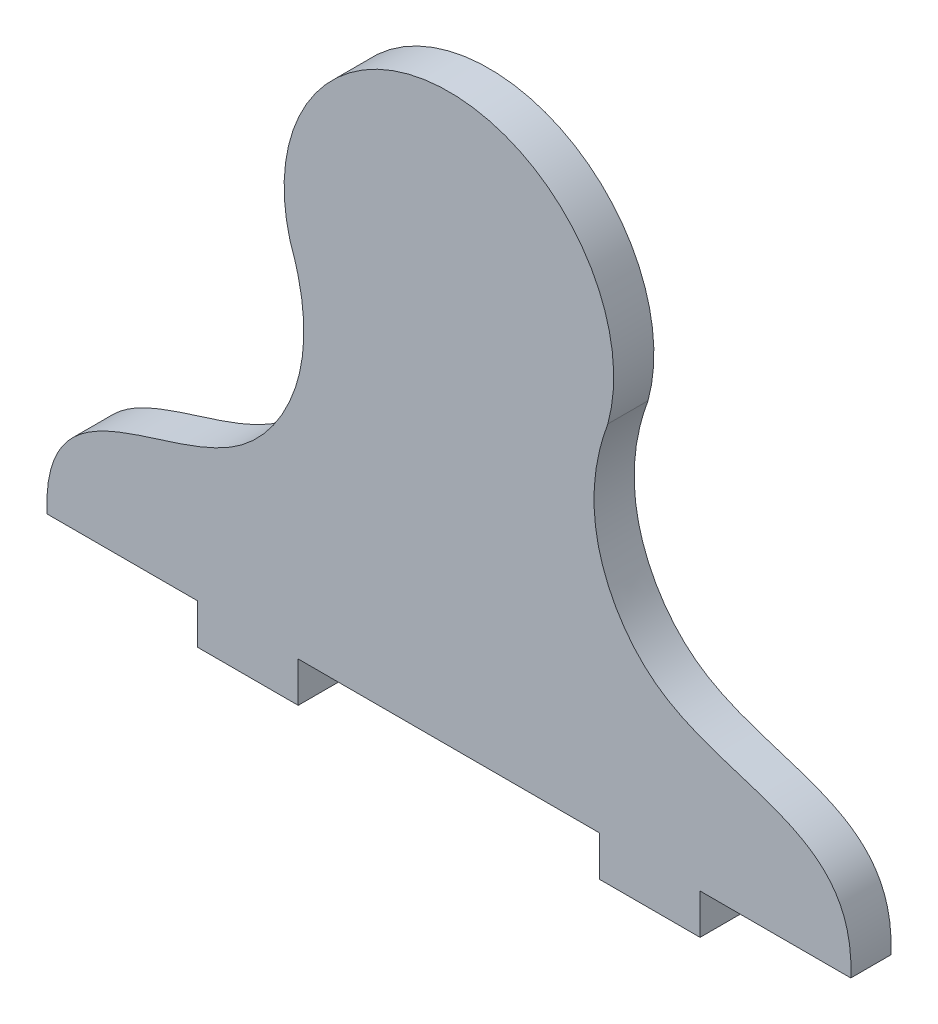
ISO-10303-21;
HEADER;
FILE_DESCRIPTION(('STEP AP214'),'2;1');
FILE_NAME('part.step','',(''),(''),'','','');
FILE_SCHEMA(('AUTOMOTIVE_DESIGN { 1 0 10303 214 1 1 1 1 }'));
ENDSEC;
DATA;
#1=APPLICATION_CONTEXT('core data for automotive mechanical design processes');
#2=APPLICATION_PROTOCOL_DEFINITION('international standard','automotive_design',2000,#1);
#3=PRODUCT_CONTEXT('',#1,'mechanical');
#4=PRODUCT('Part','Part','',(#3));
#5=PRODUCT_RELATED_PRODUCT_CATEGORY('part','',(#4));
#6=PRODUCT_DEFINITION_FORMATION('','',#4);
#7=PRODUCT_DEFINITION_CONTEXT('part definition',#1,'design');
#8=PRODUCT_DEFINITION('design','',#6,#7);
#9=PRODUCT_DEFINITION_SHAPE('','',#8);
#10=(LENGTH_UNIT() NAMED_UNIT(*) SI_UNIT(.MILLI.,.METRE.));
#11=(NAMED_UNIT(*) PLANE_ANGLE_UNIT() SI_UNIT($,.RADIAN.));
#12=(NAMED_UNIT(*) SI_UNIT($,.STERADIAN.) SOLID_ANGLE_UNIT());
#13=UNCERTAINTY_MEASURE_WITH_UNIT(LENGTH_MEASURE(1.E-05),#10,'distance_accuracy_value','');
#14=(GEOMETRIC_REPRESENTATION_CONTEXT(3) GLOBAL_UNCERTAINTY_ASSIGNED_CONTEXT((#13)) GLOBAL_UNIT_ASSIGNED_CONTEXT((#10,
#11,#12)) REPRESENTATION_CONTEXT('',''));
#15=CARTESIAN_POINT('',(0.,0.,0.));
#16=DIRECTION('',(0.,0.,1.));
#17=DIRECTION('',(1.,0.,0.));
#18=AXIS2_PLACEMENT_3D('',#15,#16,#17);
#19=CARTESIAN_POINT('',(40.,40.,4.));
#20=DIRECTION('',(0.,0.,-1.));
#21=DIRECTION('',(-1.,0.,0.));
#22=AXIS2_PLACEMENT_3D('',#19,#20,#21);
#23=CYLINDRICAL_SURFACE('',#22,16.4013850359515);
#24=CARTESIAN_POINT('',(40.,40.,0.));
#25=DIRECTION('',(0.,0.,1.));
#26=DIRECTION('',(1.,0.,0.));
#27=AXIS2_PLACEMENT_3D('',#24,#25,#26);
#28=CIRCLE('',#27,16.4013850359515);
#29=CARTESIAN_POINT('',(55.819281992137,35.6692092695694,0.));
#30=VERTEX_POINT('',#29);
#31=CARTESIAN_POINT('',(24.180718007863,35.6692092695694,0.));
#32=VERTEX_POINT('',#31);
#33=EDGE_CURVE('E151',#30,#32,#28,.T.);
#34=ORIENTED_EDGE('',*,*,#33,.T.);
#35=DIRECTION('',(0.,0.,-1.));
#36=VECTOR('',#35,1.);
#37=CARTESIAN_POINT('',(24.180718007863,35.6692092695694,4.));
#38=LINE('',#37,#36);
#39=CARTESIAN_POINT('',(24.180718007863,35.6692092695694,4.));
#40=VERTEX_POINT('',#39);
#41=EDGE_CURVE('E11',#40,#32,#38,.T.);
#42=ORIENTED_EDGE('',*,*,#41,.F.);
#43=CARTESIAN_POINT('',(40.,40.,4.));
#44=DIRECTION('',(0.,0.,1.));
#45=DIRECTION('',(1.,0.,0.));
#46=AXIS2_PLACEMENT_3D('',#43,#44,#45);
#47=CIRCLE('',#46,16.4013850359515);
#48=CARTESIAN_POINT('',(55.819281992137,35.6692092695694,4.));
#49=VERTEX_POINT('',#48);
#50=EDGE_CURVE('E95',#49,#40,#47,.T.);
#51=ORIENTED_EDGE('',*,*,#50,.F.);
#52=DIRECTION('',(0.,0.,-1.));
#53=VECTOR('',#52,1.);
#54=CARTESIAN_POINT('',(55.819281992137,35.6692092695694,4.));
#55=LINE('',#54,#53);
#56=EDGE_CURVE('E144',#49,#30,#55,.T.);
#57=ORIENTED_EDGE('',*,*,#56,.T.);
#58=EDGE_LOOP('',(#34,#42,#51,#57));
#59=FACE_BOUND('',#58,.T.);
#60=ADVANCED_FACE('F31',(#59),#23,.T.);
#61=CARTESIAN_POINT('',(0.,0.,4.));
#62=CARTESIAN_POINT('',(-0.558151578686706,12.4298564359086,4.));
#63=CARTESIAN_POINT('',(16.9175016425389,9.40079553194487,4.));
#64=CARTESIAN_POINT('',(26.3378265297337,24.3930560454273,4.));
#65=CARTESIAN_POINT('',(25.6267499995978,31.8044696165519,4.));
#66=CARTESIAN_POINT('',(24.180718007863,35.6692092695694,4.));
#67=B_SPLINE_CURVE_WITH_KNOTS('',3,(#61,#62,#63,#64,#65,#66),.UNSPECIFIED.,.F.,.F.,(4,1,1,4),
(0.,0.19768833588022,0.274980814333249,0.360749457079554),.UNSPECIFIED.);
#68=DIRECTION('',(0.,0.,-1.));
#69=VECTOR('',#68,1.);
#70=SURFACE_OF_LINEAR_EXTRUSION('',#67,#69);
#71=CARTESIAN_POINT('',(0.,0.,0.));
#72=CARTESIAN_POINT('',(-0.558151578686706,12.4298564359086,0.));
#73=CARTESIAN_POINT('',(16.9175016425389,9.40079553194487,0.));
#74=CARTESIAN_POINT('',(26.3378265297337,24.3930560454273,0.));
#75=CARTESIAN_POINT('',(25.6267499995978,31.8044696165519,0.));
#76=CARTESIAN_POINT('',(24.180718007863,35.6692092695694,0.));
#77=B_SPLINE_CURVE_WITH_KNOTS('',3,(#71,#72,#73,#74,#75,#76),.UNSPECIFIED.,.F.,.F.,(4,1,1,4),
(0.,0.19768833588022,0.274980814333249,0.360749457079554),.UNSPECIFIED.);
#78=CARTESIAN_POINT('',(0.,0.,0.));
#79=VERTEX_POINT('',#78);
#80=EDGE_CURVE('E257',#79,#32,#77,.T.);
#81=ORIENTED_EDGE('',*,*,#80,.F.);
#82=DIRECTION('',(0.,0.,-1.));
#83=VECTOR('',#82,1.);
#84=CARTESIAN_POINT('',(0.,0.,4.));
#85=LINE('',#84,#83);
#86=CARTESIAN_POINT('',(0.,0.,4.));
#87=VERTEX_POINT('',#86);
#88=EDGE_CURVE('E39',#87,#79,#85,.T.);
#89=ORIENTED_EDGE('',*,*,#88,.F.);
#90=EDGE_CURVE('E198',#87,#40,#67,.T.);
#91=ORIENTED_EDGE('',*,*,#90,.T.);
#92=ORIENTED_EDGE('',*,*,#41,.T.);
#93=EDGE_LOOP('',(#81,#89,#91,#92));
#94=FACE_BOUND('',#93,.T.);
#95=ADVANCED_FACE('F193',(#94),#70,.T.);
#96=CARTESIAN_POINT('',(39.9972327386168,0.,4.));
#97=DIRECTION('',(0.,1.,0.));
#98=DIRECTION('',(-1.,0.,0.));
#99=AXIS2_PLACEMENT_3D('',#96,#97,#98);
#100=PLANE('',#99);
#101=DIRECTION('',(1.,0.,0.));
#102=VECTOR('',#101,1.);
#103=CARTESIAN_POINT('',(39.9972327386168,0.,0.));
#104=LINE('',#103,#102);
#105=CARTESIAN_POINT('',(15.,0.,0.));
#106=VERTEX_POINT('',#105);
#107=EDGE_CURVE('E251',#79,#106,#104,.T.);
#108=ORIENTED_EDGE('',*,*,#107,.T.);
#109=DIRECTION('',(0.,0.,-1.));
#110=VECTOR('',#109,1.);
#111=CARTESIAN_POINT('',(15.,0.,4.));
#112=LINE('',#111,#110);
#113=CARTESIAN_POINT('',(15.,0.,4.));
#114=VERTEX_POINT('',#113);
#115=EDGE_CURVE('E246',#114,#106,#112,.T.);
#116=ORIENTED_EDGE('',*,*,#115,.F.);
#117=DIRECTION('',(1.,0.,0.));
#118=VECTOR('',#117,1.);
#119=CARTESIAN_POINT('',(39.9972327386168,0.,4.));
#120=LINE('',#119,#118);
#121=EDGE_CURVE('E205',#87,#114,#120,.T.);
#122=ORIENTED_EDGE('',*,*,#121,.F.);
#123=ORIENTED_EDGE('',*,*,#88,.T.);
#124=EDGE_LOOP('',(#108,#116,#122,#123));
#125=FACE_BOUND('',#124,.T.);
#126=ADVANCED_FACE('F190',(#125),#100,.F.);
#127=CARTESIAN_POINT('',(15.,-69.6766250954229,4.));
#128=DIRECTION('',(1.,0.,0.));
#129=DIRECTION('',(0.,1.,0.));
#130=AXIS2_PLACEMENT_3D('',#127,#128,#129);
#131=PLANE('',#130);
#132=DIRECTION('',(0.,-1.,0.));
#133=VECTOR('',#132,1.);
#134=CARTESIAN_POINT('',(15.,-69.6766250954229,0.));
#135=LINE('',#134,#133);
#136=CARTESIAN_POINT('',(15.,-4.,0.));
#137=VERTEX_POINT('',#136);
#138=EDGE_CURVE('E260',#106,#137,#135,.T.);
#139=ORIENTED_EDGE('',*,*,#138,.T.);
#140=DIRECTION('',(0.,0.,-1.));
#141=VECTOR('',#140,1.);
#142=CARTESIAN_POINT('',(15.,-4.,4.));
#143=LINE('',#142,#141);
#144=CARTESIAN_POINT('',(15.,-4.,4.));
#145=VERTEX_POINT('',#144);
#146=EDGE_CURVE('E244',#145,#137,#143,.T.);
#147=ORIENTED_EDGE('',*,*,#146,.F.);
#148=DIRECTION('',(0.,-1.,0.));
#149=VECTOR('',#148,1.);
#150=CARTESIAN_POINT('',(15.,-69.6766250954229,4.));
#151=LINE('',#150,#149);
#152=EDGE_CURVE('E210',#114,#145,#151,.T.);
#153=ORIENTED_EDGE('',*,*,#152,.F.);
#154=ORIENTED_EDGE('',*,*,#115,.T.);
#155=EDGE_LOOP('',(#139,#147,#153,#154));
#156=FACE_BOUND('',#155,.T.);
#157=ADVANCED_FACE('F186',(#156),#131,.F.);
#158=CARTESIAN_POINT('',(39.9972327386168,-4.,4.));
#159=DIRECTION('',(0.,-1.,0.));
#160=DIRECTION('',(0.,0.,-1.));
#161=AXIS2_PLACEMENT_3D('',#158,#159,#160);
#162=PLANE('',#161);
#163=DIRECTION('',(-1.,0.,0.));
#164=VECTOR('',#163,1.);
#165=CARTESIAN_POINT('',(39.9972327386168,-4.,0.));
#166=LINE('',#165,#164);
#167=CARTESIAN_POINT('',(25.,-4.,0.));
#168=VERTEX_POINT('',#167);
#169=EDGE_CURVE('E270',#168,#137,#166,.T.);
#170=ORIENTED_EDGE('',*,*,#169,.F.);
#171=DIRECTION('',(0.,0.,-1.));
#172=VECTOR('',#171,1.);
#173=CARTESIAN_POINT('',(25.,-4.,4.));
#174=LINE('',#173,#172);
#175=CARTESIAN_POINT('',(25.,-4.,4.));
#176=VERTEX_POINT('',#175);
#177=EDGE_CURVE('E242',#176,#168,#174,.T.);
#178=ORIENTED_EDGE('',*,*,#177,.F.);
#179=DIRECTION('',(-1.,0.,0.));
#180=VECTOR('',#179,1.);
#181=CARTESIAN_POINT('',(39.9972327386168,-4.,4.));
#182=LINE('',#181,#180);
#183=EDGE_CURVE('E212',#176,#145,#182,.T.);
#184=ORIENTED_EDGE('',*,*,#183,.T.);
#185=ORIENTED_EDGE('',*,*,#146,.T.);
#186=EDGE_LOOP('',(#170,#178,#184,#185));
#187=FACE_BOUND('',#186,.T.);
#188=ADVANCED_FACE('F182',(#187),#162,.T.);
#189=CARTESIAN_POINT('',(25.,-69.6766250954229,4.));
#190=DIRECTION('',(1.,0.,0.));
#191=DIRECTION('',(0.,0.,-1.));
#192=AXIS2_PLACEMENT_3D('',#189,#190,#191);
#193=PLANE('',#192);
#194=DIRECTION('',(0.,-1.,0.));
#195=VECTOR('',#194,1.);
#196=CARTESIAN_POINT('',(25.,-69.6766250954229,0.));
#197=LINE('',#196,#195);
#198=CARTESIAN_POINT('',(25.,0.,0.));
#199=VERTEX_POINT('',#198);
#200=EDGE_CURVE('E272',#199,#168,#197,.T.);
#201=ORIENTED_EDGE('',*,*,#200,.F.);
#202=DIRECTION('',(0.,0.,-1.));
#203=VECTOR('',#202,1.);
#204=CARTESIAN_POINT('',(25.,0.,4.));
#205=LINE('',#204,#203);
#206=CARTESIAN_POINT('',(25.,0.,4.));
#207=VERTEX_POINT('',#206);
#208=EDGE_CURVE('E240',#207,#199,#205,.T.);
#209=ORIENTED_EDGE('',*,*,#208,.F.);
#210=DIRECTION('',(0.,-1.,0.));
#211=VECTOR('',#210,1.);
#212=CARTESIAN_POINT('',(25.,-69.6766250954229,4.));
#213=LINE('',#212,#211);
#214=EDGE_CURVE('E215',#207,#176,#213,.T.);
#215=ORIENTED_EDGE('',*,*,#214,.T.);
#216=ORIENTED_EDGE('',*,*,#177,.T.);
#217=EDGE_LOOP('',(#201,#209,#215,#216));
#218=FACE_BOUND('',#217,.T.);
#219=ADVANCED_FACE('F178',(#218),#193,.T.);
#220=CARTESIAN_POINT('',(39.9972327386168,0.,4.));
#221=DIRECTION('',(0.,1.,0.));
#222=DIRECTION('',(0.,0.,1.));
#223=AXIS2_PLACEMENT_3D('',#220,#221,#222);
#224=PLANE('',#223);
#225=DIRECTION('',(1.,0.,0.));
#226=VECTOR('',#225,1.);
#227=CARTESIAN_POINT('',(39.9972327386168,0.,0.));
#228=LINE('',#227,#226);
#229=CARTESIAN_POINT('',(55.,0.,0.));
#230=VERTEX_POINT('',#229);
#231=EDGE_CURVE('E275',#199,#230,#228,.T.);
#232=ORIENTED_EDGE('',*,*,#231,.T.);
#233=DIRECTION('',(0.,0.,-1.));
#234=VECTOR('',#233,1.);
#235=CARTESIAN_POINT('',(55.,0.,4.));
#236=LINE('',#235,#234);
#237=CARTESIAN_POINT('',(55.,0.,4.));
#238=VERTEX_POINT('',#237);
#239=EDGE_CURVE('E233',#238,#230,#236,.T.);
#240=ORIENTED_EDGE('',*,*,#239,.F.);
#241=DIRECTION('',(1.,0.,0.));
#242=VECTOR('',#241,1.);
#243=CARTESIAN_POINT('',(39.9972327386168,0.,4.));
#244=LINE('',#243,#242);
#245=EDGE_CURVE('E218',#207,#238,#244,.T.);
#246=ORIENTED_EDGE('',*,*,#245,.F.);
#247=ORIENTED_EDGE('',*,*,#208,.T.);
#248=EDGE_LOOP('',(#232,#240,#246,#247));
#249=FACE_BOUND('',#248,.T.);
#250=ADVANCED_FACE('F174',(#249),#224,.F.);
#251=CARTESIAN_POINT('',(55.,-69.6766250954229,4.));
#252=DIRECTION('',(1.,0.,0.));
#253=DIRECTION('',(0.,0.,-1.));
#254=AXIS2_PLACEMENT_3D('',#251,#252,#253);
#255=PLANE('',#254);
#256=DIRECTION('',(0.,-1.,0.));
#257=VECTOR('',#256,1.);
#258=CARTESIAN_POINT('',(55.,-69.6766250954229,0.));
#259=LINE('',#258,#257);
#260=CARTESIAN_POINT('',(55.,-4.,0.));
#261=VERTEX_POINT('',#260);
#262=EDGE_CURVE('E230',#230,#261,#259,.T.);
#263=ORIENTED_EDGE('',*,*,#262,.T.);
#264=DIRECTION('',(0.,0.,-1.));
#265=VECTOR('',#264,1.);
#266=CARTESIAN_POINT('',(55.,-4.,4.));
#267=LINE('',#266,#265);
#268=CARTESIAN_POINT('',(55.,-4.,4.));
#269=VERTEX_POINT('',#268);
#270=EDGE_CURVE('E228',#269,#261,#267,.T.);
#271=ORIENTED_EDGE('',*,*,#270,.F.);
#272=DIRECTION('',(0.,-1.,0.));
#273=VECTOR('',#272,1.);
#274=CARTESIAN_POINT('',(55.,-69.6766250954229,4.));
#275=LINE('',#274,#273);
#276=EDGE_CURVE('E220',#238,#269,#275,.T.);
#277=ORIENTED_EDGE('',*,*,#276,.F.);
#278=ORIENTED_EDGE('',*,*,#239,.T.);
#279=EDGE_LOOP('',(#263,#271,#277,#278));
#280=FACE_BOUND('',#279,.T.);
#281=ADVANCED_FACE('F170',(#280),#255,.F.);
#282=CARTESIAN_POINT('',(39.9972327386168,-4.,4.));
#283=DIRECTION('',(0.,1.,0.));
#284=DIRECTION('',(0.,0.,1.));
#285=AXIS2_PLACEMENT_3D('',#282,#283,#284);
#286=PLANE('',#285);
#287=DIRECTION('',(1.,0.,0.));
#288=VECTOR('',#287,1.);
#289=CARTESIAN_POINT('',(39.9972327386168,-4.,0.));
#290=LINE('',#289,#288);
#291=CARTESIAN_POINT('',(65.,-4.,0.));
#292=VERTEX_POINT('',#291);
#293=EDGE_CURVE('E235',#261,#292,#290,.T.);
#294=ORIENTED_EDGE('',*,*,#293,.T.);
#295=DIRECTION('',(0.,0.,-1.));
#296=VECTOR('',#295,1.);
#297=CARTESIAN_POINT('',(65.,-4.,4.));
#298=LINE('',#297,#296);
#299=CARTESIAN_POINT('',(65.,-4.,4.));
#300=VERTEX_POINT('',#299);
#301=EDGE_CURVE('E134',#300,#292,#298,.T.);
#302=ORIENTED_EDGE('',*,*,#301,.F.);
#303=DIRECTION('',(1.,0.,0.));
#304=VECTOR('',#303,1.);
#305=CARTESIAN_POINT('',(39.9972327386168,-4.,4.));
#306=LINE('',#305,#304);
#307=EDGE_CURVE('E139',#269,#300,#306,.T.);
#308=ORIENTED_EDGE('',*,*,#307,.F.);
#309=ORIENTED_EDGE('',*,*,#270,.T.);
#310=EDGE_LOOP('',(#294,#302,#308,#309));
#311=FACE_BOUND('',#310,.T.);
#312=ADVANCED_FACE('F167',(#311),#286,.F.);
#313=CARTESIAN_POINT('',(65.,-69.6766250954229,4.));
#314=DIRECTION('',(1.,0.,0.));
#315=DIRECTION('',(0.,0.,-1.));
#316=AXIS2_PLACEMENT_3D('',#313,#314,#315);
#317=PLANE('',#316);
#318=DIRECTION('',(0.,-1.,0.));
#319=VECTOR('',#318,1.);
#320=CARTESIAN_POINT('',(65.,-69.6766250954229,0.));
#321=LINE('',#320,#319);
#322=CARTESIAN_POINT('',(65.,0.,0.));
#323=VERTEX_POINT('',#322);
#324=EDGE_CURVE('E129',#323,#292,#321,.T.);
#325=ORIENTED_EDGE('',*,*,#324,.F.);
#326=DIRECTION('',(0.,0.,-1.));
#327=VECTOR('',#326,1.);
#328=CARTESIAN_POINT('',(65.,0.,4.));
#329=LINE('',#328,#327);
#330=CARTESIAN_POINT('',(65.,0.,4.));
#331=VERTEX_POINT('',#330);
#332=EDGE_CURVE('E124',#331,#323,#329,.T.);
#333=ORIENTED_EDGE('',*,*,#332,.F.);
#334=DIRECTION('',(0.,-1.,0.));
#335=VECTOR('',#334,1.);
#336=CARTESIAN_POINT('',(65.,-69.6766250954229,4.));
#337=LINE('',#336,#335);
#338=EDGE_CURVE('E127',#331,#300,#337,.T.);
#339=ORIENTED_EDGE('',*,*,#338,.T.);
#340=ORIENTED_EDGE('',*,*,#301,.T.);
#341=EDGE_LOOP('',(#325,#333,#339,#340));
#342=FACE_BOUND('',#341,.T.);
#343=ADVANCED_FACE('F126',(#342),#317,.T.);
#344=CARTESIAN_POINT('',(39.9972327386168,0.,4.));
#345=DIRECTION('',(0.,-1.,0.));
#346=DIRECTION('',(1.,0.,0.));
#347=AXIS2_PLACEMENT_3D('',#344,#345,#346);
#348=PLANE('',#347);
#349=DIRECTION('',(-1.,0.,0.));
#350=VECTOR('',#349,1.);
#351=CARTESIAN_POINT('',(39.9972327386168,0.,0.));
#352=LINE('',#351,#350);
#353=CARTESIAN_POINT('',(80.,0.,0.));
#354=VERTEX_POINT('',#353);
#355=EDGE_CURVE('E280',#354,#323,#352,.T.);
#356=ORIENTED_EDGE('',*,*,#355,.F.);
#357=DIRECTION('',(0.,0.,-1.));
#358=VECTOR('',#357,1.);
#359=CARTESIAN_POINT('',(80.,0.,4.));
#360=LINE('',#359,#358);
#361=CARTESIAN_POINT('',(80.,0.,4.));
#362=VERTEX_POINT('',#361);
#363=EDGE_CURVE('E86',#362,#354,#360,.T.);
#364=ORIENTED_EDGE('',*,*,#363,.F.);
#365=DIRECTION('',(-1.,0.,0.));
#366=VECTOR('',#365,1.);
#367=CARTESIAN_POINT('',(39.9972327386168,0.,4.));
#368=LINE('',#367,#366);
#369=EDGE_CURVE('E137',#362,#331,#368,.T.);
#370=ORIENTED_EDGE('',*,*,#369,.T.);
#371=ORIENTED_EDGE('',*,*,#332,.T.);
#372=EDGE_LOOP('',(#356,#364,#370,#371));
#373=FACE_BOUND('',#372,.T.);
#374=ADVANCED_FACE('F142',(#373),#348,.T.);
#375=CARTESIAN_POINT('',(80.,0.,4.));
#376=CARTESIAN_POINT('',(80.5581515786867,12.4298564359086,4.));
#377=CARTESIAN_POINT('',(63.0824983574611,9.40079553194487,4.));
#378=CARTESIAN_POINT('',(53.6621734702663,24.3930560454273,4.));
#379=CARTESIAN_POINT('',(54.3732500004022,31.8044696165519,4.));
#380=CARTESIAN_POINT('',(55.819281992137,35.6692092695694,4.));
#381=B_SPLINE_CURVE_WITH_KNOTS('',3,(#375,#376,#377,#378,#379,#380),.UNSPECIFIED.,.F.,.F.,(4,1,
1,4),(0.,0.19768833588022,0.274980814333249,0.360749457079554),.UNSPECIFIED.);
#382=DIRECTION('',(0.,0.,-1.));
#383=VECTOR('',#382,1.);
#384=SURFACE_OF_LINEAR_EXTRUSION('',#381,#383);
#385=CARTESIAN_POINT('',(80.,0.,0.));
#386=CARTESIAN_POINT('',(80.5581515786867,12.4298564359086,0.));
#387=CARTESIAN_POINT('',(63.0824983574611,9.40079553194487,0.));
#388=CARTESIAN_POINT('',(53.6621734702663,24.3930560454273,0.));
#389=CARTESIAN_POINT('',(54.3732500004022,31.8044696165519,0.));
#390=CARTESIAN_POINT('',(55.819281992137,35.6692092695694,0.));
#391=B_SPLINE_CURVE_WITH_KNOTS('',3,(#385,#386,#387,#388,#389,#390),.UNSPECIFIED.,.F.,.F.,(4,1,
1,4),(0.,0.19768833588022,0.274980814333249,0.360749457079554),.UNSPECIFIED.);
#392=EDGE_CURVE('E89',#354,#30,#391,.T.);
#393=ORIENTED_EDGE('',*,*,#392,.T.);
#394=ORIENTED_EDGE('',*,*,#56,.F.);
#395=EDGE_CURVE('E47',#362,#49,#381,.T.);
#396=ORIENTED_EDGE('',*,*,#395,.F.);
#397=ORIENTED_EDGE('',*,*,#363,.T.);
#398=EDGE_LOOP('',(#393,#394,#396,#397));
#399=FACE_BOUND('',#398,.T.);
#400=ADVANCED_FACE('F157',(#399),#384,.F.);
#401=CARTESIAN_POINT('',(39.9972327386168,-69.6766250954229,4.));
#402=DIRECTION('',(0.,0.,1.));
#403=DIRECTION('',(1.,0.,0.));
#404=AXIS2_PLACEMENT_3D('',#401,#402,#403);
#405=PLANE('',#404);
#406=ORIENTED_EDGE('',*,*,#50,.T.);
#407=ORIENTED_EDGE('',*,*,#90,.F.);
#408=ORIENTED_EDGE('',*,*,#121,.T.);
#409=ORIENTED_EDGE('',*,*,#152,.T.);
#410=ORIENTED_EDGE('',*,*,#183,.F.);
#411=ORIENTED_EDGE('',*,*,#214,.F.);
#412=ORIENTED_EDGE('',*,*,#245,.T.);
#413=ORIENTED_EDGE('',*,*,#276,.T.);
#414=ORIENTED_EDGE('',*,*,#307,.T.);
#415=ORIENTED_EDGE('',*,*,#338,.F.);
#416=ORIENTED_EDGE('',*,*,#369,.F.);
#417=ORIENTED_EDGE('',*,*,#395,.T.);
#418=EDGE_LOOP('',(#406,#407,#408,#409,#410,#411,#412,#413,#414,#415,#416,#417));
#419=FACE_BOUND('',#418,.T.);
#420=ADVANCED_FACE('F136',(#419),#405,.T.);
#421=CARTESIAN_POINT('',(39.9972327386168,-69.6766250954229,0.));
#422=DIRECTION('',(0.,0.,1.));
#423=DIRECTION('',(1.,0.,0.));
#424=AXIS2_PLACEMENT_3D('',#421,#422,#423);
#425=PLANE('',#424);
#426=ORIENTED_EDGE('',*,*,#33,.F.);
#427=ORIENTED_EDGE('',*,*,#392,.F.);
#428=ORIENTED_EDGE('',*,*,#355,.T.);
#429=ORIENTED_EDGE('',*,*,#324,.T.);
#430=ORIENTED_EDGE('',*,*,#293,.F.);
#431=ORIENTED_EDGE('',*,*,#262,.F.);
#432=ORIENTED_EDGE('',*,*,#231,.F.);
#433=ORIENTED_EDGE('',*,*,#200,.T.);
#434=ORIENTED_EDGE('',*,*,#169,.T.);
#435=ORIENTED_EDGE('',*,*,#138,.F.);
#436=ORIENTED_EDGE('',*,*,#107,.F.);
#437=ORIENTED_EDGE('',*,*,#80,.T.);
#438=EDGE_LOOP('',(#426,#427,#428,#429,#430,#431,#432,#433,#434,#435,#436,#437));
#439=FACE_BOUND('',#438,.T.);
#440=ADVANCED_FACE('F161',(#439),#425,.F.);
#441=CLOSED_SHELL('',(#60,#95,#126,#157,#188,#219,#250,#281,#312,#343,#374,#400,#420,#440));
#442=MANIFOLD_SOLID_BREP('B2',#441);
#443=ADVANCED_BREP_SHAPE_REPRESENTATION('',(#18,#442),#14);
#444=SHAPE_DEFINITION_REPRESENTATION(#9,#443);
ENDSEC;
END-ISO-10303-21;
